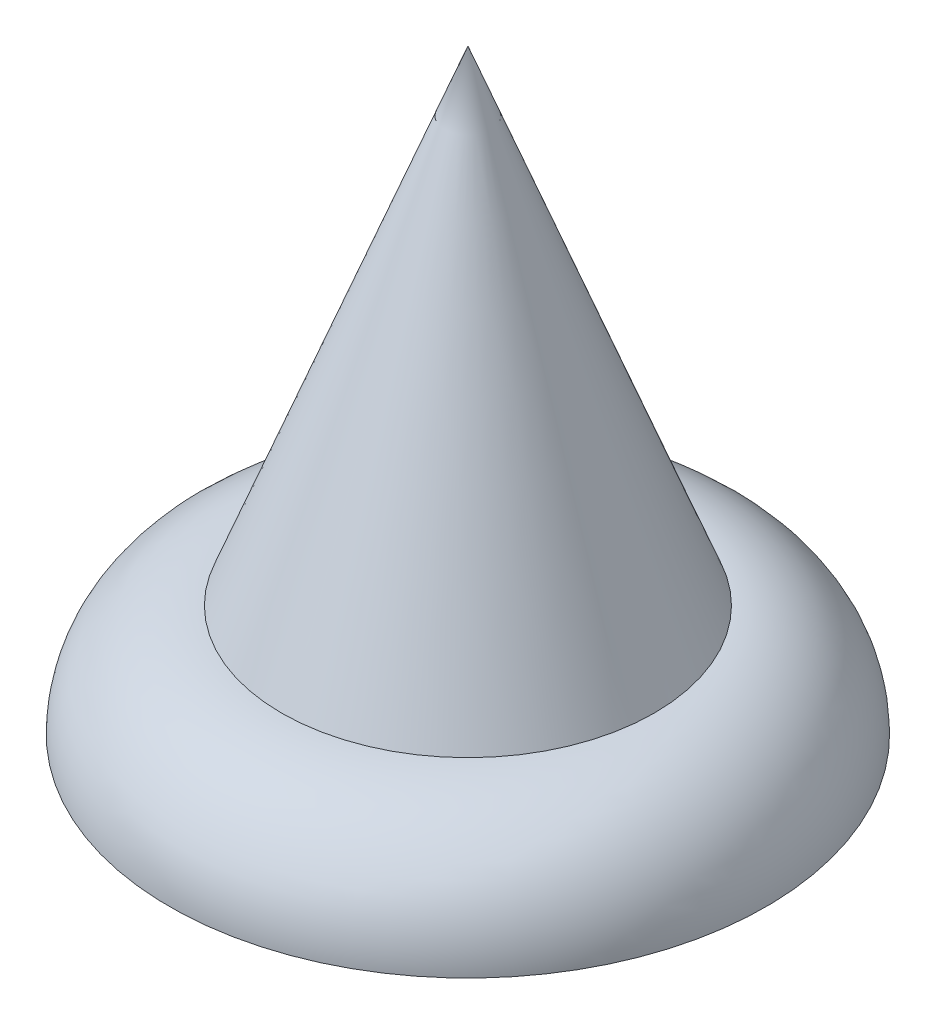
ISO-10303-21;
HEADER;
FILE_DESCRIPTION(('STEP AP214'),'2;1');
FILE_NAME('part.step','',(''),(''),'','','');
FILE_SCHEMA(('AUTOMOTIVE_DESIGN { 1 0 10303 214 1 1 1 1 }'));
ENDSEC;
DATA;
#1=APPLICATION_CONTEXT('core data for automotive mechanical design processes');
#2=APPLICATION_PROTOCOL_DEFINITION('international standard','automotive_design',2000,#1);
#3=PRODUCT_CONTEXT('',#1,'mechanical');
#4=PRODUCT('Part','Part','',(#3));
#5=PRODUCT_RELATED_PRODUCT_CATEGORY('part','',(#4));
#6=PRODUCT_DEFINITION_FORMATION('','',#4);
#7=PRODUCT_DEFINITION_CONTEXT('part definition',#1,'design');
#8=PRODUCT_DEFINITION('design','',#6,#7);
#9=PRODUCT_DEFINITION_SHAPE('','',#8);
#10=(LENGTH_UNIT() NAMED_UNIT(*) SI_UNIT(.MILLI.,.METRE.));
#11=(NAMED_UNIT(*) PLANE_ANGLE_UNIT() SI_UNIT($,.RADIAN.));
#12=(NAMED_UNIT(*) SI_UNIT($,.STERADIAN.) SOLID_ANGLE_UNIT());
#13=UNCERTAINTY_MEASURE_WITH_UNIT(LENGTH_MEASURE(1.E-05),#10,'distance_accuracy_value','');
#14=(GEOMETRIC_REPRESENTATION_CONTEXT(3) GLOBAL_UNCERTAINTY_ASSIGNED_CONTEXT((#13)) GLOBAL_UNIT_ASSIGNED_CONTEXT((#10,
#11,#12)) REPRESENTATION_CONTEXT('',''));
#15=CARTESIAN_POINT('',(0.,0.,0.));
#16=DIRECTION('',(0.,0.,1.));
#17=DIRECTION('',(1.,0.,0.));
#18=AXIS2_PLACEMENT_3D('',#15,#16,#17);
#19=CARTESIAN_POINT('',(-12.5,7.5,0.));
#20=DIRECTION('',(0.,1.,0.));
#21=DIRECTION('',(-1.,0.,0.));
#22=AXIS2_PLACEMENT_3D('',#19,#20,#21);
#23=PLANE('',#22);
#24=CARTESIAN_POINT('',(0.,7.5,0.));
#25=DIRECTION('',(0.,-1.,0.));
#26=DIRECTION('',(1.,0.,0.));
#27=AXIS2_PLACEMENT_3D('',#24,#25,#26);
#28=CIRCLE('',#27,0.85);
#29=CARTESIAN_POINT('',(0.85,7.5,0.));
#30=VERTEX_POINT('',#29);
#31=EDGE_CURVE('E76',#30,#30,#28,.T.);
#32=ORIENTED_EDGE('',*,*,#31,.F.);
#33=EDGE_LOOP('',(#32));
#34=FACE_BOUND('',#33,.T.);
#35=CARTESIAN_POINT('',(0.,7.5,0.));
#36=DIRECTION('',(0.,-1.,0.));
#37=DIRECTION('',(1.,0.,0.));
#38=AXIS2_PLACEMENT_3D('',#35,#36,#37);
#39=CIRCLE('',#38,12.5);
#40=CARTESIAN_POINT('',(12.5,7.5,0.));
#41=VERTEX_POINT('',#40);
#42=EDGE_CURVE('E12',#41,#41,#39,.T.);
#43=ORIENTED_EDGE('',*,*,#42,.T.);
#44=EDGE_LOOP('',(#43));
#45=FACE_BOUND('',#44,.T.);
#46=ADVANCED_FACE('F46',(#34,#45),#23,.F.);
#47=CARTESIAN_POINT('',(0.,40.,0.));
#48=DIRECTION('',(0.,-1.,0.));
#49=DIRECTION('',(1.,0.,0.));
#50=AXIS2_PLACEMENT_3D('',#47,#48,#49);
#51=CONICAL_SURFACE('',#50,0.,0.367173833818219);
#52=ORIENTED_EDGE('',*,*,#42,.F.);
#53=EDGE_LOOP('',(#52));
#54=FACE_BOUND('',#53,.T.);
#55=CARTESIAN_POINT('',(0.,40.,0.));
#56=VERTEX_POINT('',#55);
#57=VERTEX_LOOP('',#56);
#58=FACE_BOUND('',#57,.T.);
#59=ADVANCED_FACE('F55',(#54,#58),#51,.T.);
#60=CARTESIAN_POINT('',(0.,17.5,0.));
#61=DIRECTION('',(0.,-1.,0.));
#62=DIRECTION('',(1.,0.,0.));
#63=AXIS2_PLACEMENT_3D('',#60,#61,#62);
#64=CYLINDRICAL_SURFACE('',#63,0.85);
#65=CARTESIAN_POINT('',(0.,17.5,0.));
#66=DIRECTION('',(0.,-1.,0.));
#67=DIRECTION('',(1.,0.,0.));
#68=AXIS2_PLACEMENT_3D('',#65,#66,#67);
#69=CIRCLE('',#68,0.85);
#70=CARTESIAN_POINT('',(0.85,17.5,0.));
#71=VERTEX_POINT('',#70);
#72=EDGE_CURVE('E52',#71,#71,#69,.T.);
#73=ORIENTED_EDGE('',*,*,#72,.F.);
#74=EDGE_LOOP('',(#73));
#75=FACE_BOUND('',#74,.T.);
#76=ORIENTED_EDGE('',*,*,#31,.T.);
#77=EDGE_LOOP('',(#76));
#78=FACE_BOUND('',#77,.T.);
#79=ADVANCED_FACE('F57',(#75,#78),#64,.F.);
#80=CARTESIAN_POINT('',(0.,17.5,0.));
#81=DIRECTION('',(0.,-1.,0.));
#82=DIRECTION('',(1.,0.,0.));
#83=AXIS2_PLACEMENT_3D('',#80,#81,#82);
#84=PLANE('',#83);
#85=ORIENTED_EDGE('',*,*,#72,.T.);
#86=EDGE_LOOP('',(#85));
#87=FACE_BOUND('',#86,.T.);
#88=ADVANCED_FACE('F63',(#87),#84,.T.);
#89=CLOSED_SHELL('',(#46,#59,#79,#88));
#90=MANIFOLD_SOLID_BREP('B2',#89);
#91=CARTESIAN_POINT('',(0.,0.,0.));
#92=DIRECTION('',(0.,1.,0.));
#93=DIRECTION('',(0.,0.,1.));
#94=AXIS2_PLACEMENT_3D('',#91,#92,#93);
#95=PLANE('',#94);
#96=CARTESIAN_POINT('',(0.,0.,0.));
#97=DIRECTION('',(0.,-1.,0.));
#98=DIRECTION('',(0.,0.,-1.));
#99=AXIS2_PLACEMENT_3D('',#96,#97,#98);
#100=CIRCLE('',#99,1.1);
#101=CARTESIAN_POINT('',(0.,0.,-1.1));
#102=VERTEX_POINT('',#101);
#103=EDGE_CURVE('E119',#102,#102,#100,.T.);
#104=ORIENTED_EDGE('',*,*,#103,.F.);
#105=EDGE_LOOP('',(#104));
#106=FACE_BOUND('',#105,.T.);
#107=CARTESIAN_POINT('',(0.,0.,0.));
#108=DIRECTION('',(0.,-1.,0.));
#109=DIRECTION('',(0.,0.,-1.));
#110=AXIS2_PLACEMENT_3D('',#107,#108,#109);
#111=CIRCLE('',#110,20.);
#112=CARTESIAN_POINT('',(0.,0.,-20.));
#113=VERTEX_POINT('',#112);
#114=EDGE_CURVE('E113',#113,#113,#111,.T.);
#115=ORIENTED_EDGE('',*,*,#114,.T.);
#116=EDGE_LOOP('',(#115));
#117=FACE_BOUND('',#116,.T.);
#118=ADVANCED_FACE('F106',(#106,#117),#95,.F.);
#119=CARTESIAN_POINT('',(0.,7.5,0.));
#120=DIRECTION('',(0.,-1.,0.));
#121=DIRECTION('',(0.,0.,-1.));
#122=AXIS2_PLACEMENT_3D('',#119,#120,#121);
#123=PLANE('',#122);
#124=CARTESIAN_POINT('',(0.,7.5,0.));
#125=DIRECTION('',(0.,-1.,0.));
#126=DIRECTION('',(0.,0.,-1.));
#127=AXIS2_PLACEMENT_3D('',#124,#125,#126);
#128=CIRCLE('',#127,1.1);
#129=CARTESIAN_POINT('',(0.,7.5,-1.1));
#130=VERTEX_POINT('',#129);
#131=EDGE_CURVE('E109',#130,#130,#128,.T.);
#132=ORIENTED_EDGE('',*,*,#131,.T.);
#133=EDGE_LOOP('',(#132));
#134=FACE_BOUND('',#133,.T.);
#135=CARTESIAN_POINT('',(0.,7.5,0.));
#136=DIRECTION('',(0.,-1.,0.));
#137=DIRECTION('',(0.,0.,-1.));
#138=AXIS2_PLACEMENT_3D('',#135,#136,#137);
#139=CIRCLE('',#138,12.5);
#140=CARTESIAN_POINT('',(0.,7.5,-12.5));
#141=VERTEX_POINT('',#140);
#142=EDGE_CURVE('E45',#141,#141,#139,.T.);
#143=ORIENTED_EDGE('',*,*,#142,.F.);
#144=EDGE_LOOP('',(#143));
#145=FACE_BOUND('',#144,.T.);
#146=ADVANCED_FACE('F126',(#134,#145),#123,.F.);
#147=CARTESIAN_POINT('',(0.,0.,0.));
#148=DIRECTION('',(0.,-1.,0.));
#149=DIRECTION('',(0.,0.,-1.));
#150=AXIS2_PLACEMENT_3D('',#147,#148,#149);
#151=TOROIDAL_SURFACE('',#150,12.5,7.5);
#152=ORIENTED_EDGE('',*,*,#114,.F.);
#153=EDGE_LOOP('',(#152));
#154=FACE_BOUND('',#153,.T.);
#155=ORIENTED_EDGE('',*,*,#142,.T.);
#156=EDGE_LOOP('',(#155));
#157=FACE_BOUND('',#156,.T.);
#158=ADVANCED_FACE('F131',(#154,#157),#151,.T.);
#159=CARTESIAN_POINT('',(0.,40.,0.));
#160=DIRECTION('',(0.,-1.,0.));
#161=DIRECTION('',(0.,0.,-1.));
#162=AXIS2_PLACEMENT_3D('',#159,#160,#161);
#163=CYLINDRICAL_SURFACE('',#162,1.1);
#164=ORIENTED_EDGE('',*,*,#103,.T.);
#165=EDGE_LOOP('',(#164));
#166=FACE_BOUND('',#165,.T.);
#167=ORIENTED_EDGE('',*,*,#131,.F.);
#168=EDGE_LOOP('',(#167));
#169=FACE_BOUND('',#168,.T.);
#170=ADVANCED_FACE('F129',(#166,#169),#163,.F.);
#171=CLOSED_SHELL('',(#118,#146,#158,#170));
#172=MANIFOLD_SOLID_BREP('B6',#171);
#173=ADVANCED_BREP_SHAPE_REPRESENTATION('',(#18,#90,#172),#14);
#174=SHAPE_DEFINITION_REPRESENTATION(#9,#173);
ENDSEC;
END-ISO-10303-21;
